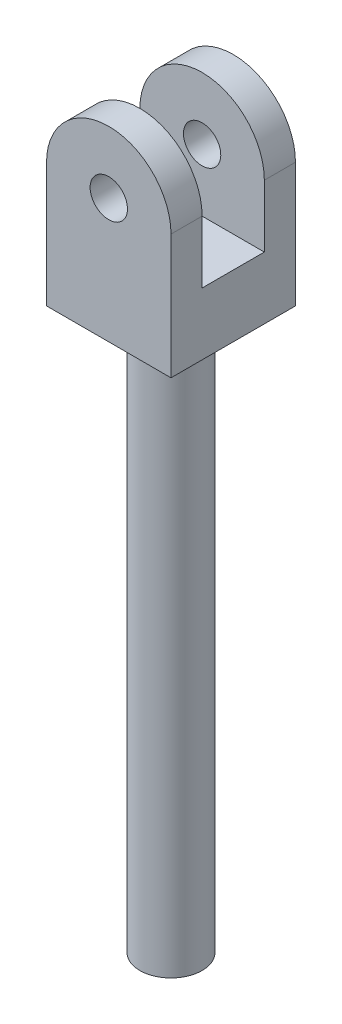
ISO-10303-21;
HEADER;
FILE_DESCRIPTION(('STEP AP214'),'2;1');
FILE_NAME('part.step','',(''),(''),'','','');
FILE_SCHEMA(('AUTOMOTIVE_DESIGN { 1 0 10303 214 1 1 1 1 }'));
ENDSEC;
DATA;
#1=APPLICATION_CONTEXT('core data for automotive mechanical design processes');
#2=APPLICATION_PROTOCOL_DEFINITION('international standard','automotive_design',2000,#1);
#3=PRODUCT_CONTEXT('',#1,'mechanical');
#4=PRODUCT('Part','Part','',(#3));
#5=PRODUCT_RELATED_PRODUCT_CATEGORY('part','',(#4));
#6=PRODUCT_DEFINITION_FORMATION('','',#4);
#7=PRODUCT_DEFINITION_CONTEXT('part definition',#1,'design');
#8=PRODUCT_DEFINITION('design','',#6,#7);
#9=PRODUCT_DEFINITION_SHAPE('','',#8);
#10=(LENGTH_UNIT() NAMED_UNIT(*) SI_UNIT(.MILLI.,.METRE.));
#11=(NAMED_UNIT(*) PLANE_ANGLE_UNIT() SI_UNIT($,.RADIAN.));
#12=(NAMED_UNIT(*) SI_UNIT($,.STERADIAN.) SOLID_ANGLE_UNIT());
#13=UNCERTAINTY_MEASURE_WITH_UNIT(LENGTH_MEASURE(1.E-05),#10,'distance_accuracy_value','');
#14=(GEOMETRIC_REPRESENTATION_CONTEXT(3) GLOBAL_UNCERTAINTY_ASSIGNED_CONTEXT((#13)) GLOBAL_UNIT_ASSIGNED_CONTEXT((#10,
#11,#12)) REPRESENTATION_CONTEXT('',''));
#15=CARTESIAN_POINT('',(0.,0.,0.));
#16=DIRECTION('',(0.,0.,1.));
#17=DIRECTION('',(1.,0.,0.));
#18=AXIS2_PLACEMENT_3D('',#15,#16,#17);
#19=CARTESIAN_POINT('',(0.,0.,10.));
#20=DIRECTION('',(0.,0.,-1.));
#21=DIRECTION('',(-1.,0.,0.));
#22=AXIS2_PLACEMENT_3D('',#19,#20,#21);
#23=CYLINDRICAL_SURFACE('',#22,5.);
#24=CARTESIAN_POINT('',(0.,0.,2.5));
#25=DIRECTION('',(0.,0.,-1.));
#26=DIRECTION('',(0.,1.,0.));
#27=AXIS2_PLACEMENT_3D('',#24,#25,#26);
#28=CIRCLE('',#27,5.);
#29=CARTESIAN_POINT('',(-5.,0.,2.5));
#30=VERTEX_POINT('',#29);
#31=CARTESIAN_POINT('',(5.,0.,2.5));
#32=VERTEX_POINT('',#31);
#33=EDGE_CURVE('E119',#30,#32,#28,.T.);
#34=ORIENTED_EDGE('',*,*,#33,.T.);
#35=DIRECTION('',(0.,0.,-1.));
#36=VECTOR('',#35,1.);
#37=CARTESIAN_POINT('',(5.,0.,10.));
#38=LINE('',#37,#36);
#39=CARTESIAN_POINT('',(5.,0.,0.));
#40=VERTEX_POINT('',#39);
#41=EDGE_CURVE('E78',#32,#40,#38,.T.);
#42=ORIENTED_EDGE('',*,*,#41,.T.);
#43=CARTESIAN_POINT('',(0.,0.,0.));
#44=DIRECTION('',(0.,0.,1.));
#45=DIRECTION('',(1.,0.,0.));
#46=AXIS2_PLACEMENT_3D('',#43,#44,#45);
#47=CIRCLE('',#46,5.);
#48=CARTESIAN_POINT('',(-5.,0.,0.));
#49=VERTEX_POINT('',#48);
#50=EDGE_CURVE('E145',#40,#49,#47,.T.);
#51=ORIENTED_EDGE('',*,*,#50,.T.);
#52=DIRECTION('',(0.,0.,-1.));
#53=VECTOR('',#52,1.);
#54=CARTESIAN_POINT('',(-5.,0.,10.));
#55=LINE('',#54,#53);
#56=EDGE_CURVE('E170',#30,#49,#55,.T.);
#57=ORIENTED_EDGE('',*,*,#56,.F.);
#58=EDGE_LOOP('',(#34,#42,#51,#57));
#59=FACE_BOUND('',#58,.T.);
#60=ADVANCED_FACE('F32',(#59),#23,.T.);
#61=CARTESIAN_POINT('',(0.,0.,10.));
#62=DIRECTION('',(0.,0.,-1.));
#63=DIRECTION('',(-1.,0.,0.));
#64=AXIS2_PLACEMENT_3D('',#61,#62,#63);
#65=CYLINDRICAL_SURFACE('',#64,1.5);
#66=CARTESIAN_POINT('',(0.,0.,2.5));
#67=DIRECTION('',(0.,0.,-1.));
#68=DIRECTION('',(0.,1.,0.));
#69=AXIS2_PLACEMENT_3D('',#66,#67,#68);
#70=CIRCLE('',#69,1.5);
#71=CARTESIAN_POINT('',(0.,1.5,2.5));
#72=VERTEX_POINT('',#71);
#73=EDGE_CURVE('E134',#72,#72,#70,.T.);
#74=ORIENTED_EDGE('',*,*,#73,.F.);
#75=EDGE_LOOP('',(#74));
#76=FACE_BOUND('',#75,.T.);
#77=CARTESIAN_POINT('',(0.,0.,0.));
#78=DIRECTION('',(0.,0.,1.));
#79=DIRECTION('',(1.,0.,0.));
#80=AXIS2_PLACEMENT_3D('',#77,#78,#79);
#81=CIRCLE('',#80,1.5);
#82=CARTESIAN_POINT('',(1.5,0.,0.));
#83=VERTEX_POINT('',#82);
#84=EDGE_CURVE('E141',#83,#83,#81,.T.);
#85=ORIENTED_EDGE('',*,*,#84,.F.);
#86=EDGE_LOOP('',(#85));
#87=FACE_BOUND('',#86,.T.);
#88=ADVANCED_FACE('F180',(#76,#87),#65,.F.);
#89=CARTESIAN_POINT('',(-5.,-10.,10.));
#90=DIRECTION('',(0.,1.,0.));
#91=DIRECTION('',(0.,0.,1.));
#92=AXIS2_PLACEMENT_3D('',#89,#90,#91);
#93=PLANE('',#92);
#94=DIRECTION('',(1.,0.,0.));
#95=VECTOR('',#94,1.);
#96=CARTESIAN_POINT('',(-5.,-10.,0.));
#97=LINE('',#96,#95);
#98=CARTESIAN_POINT('',(-5.,-10.,0.));
#99=VERTEX_POINT('',#98);
#100=CARTESIAN_POINT('',(5.,-10.,0.));
#101=VERTEX_POINT('',#100);
#102=EDGE_CURVE('E158',#99,#101,#97,.T.);
#103=ORIENTED_EDGE('',*,*,#102,.T.);
#104=DIRECTION('',(0.,0.,-1.));
#105=VECTOR('',#104,1.);
#106=CARTESIAN_POINT('',(5.,-10.,10.));
#107=LINE('',#106,#105);
#108=CARTESIAN_POINT('',(5.,-10.,10.));
#109=VERTEX_POINT('',#108);
#110=EDGE_CURVE('E164',#109,#101,#107,.T.);
#111=ORIENTED_EDGE('',*,*,#110,.F.);
#112=DIRECTION('',(1.,0.,0.));
#113=VECTOR('',#112,1.);
#114=CARTESIAN_POINT('',(-5.,-10.,10.));
#115=LINE('',#114,#113);
#116=CARTESIAN_POINT('',(-5.,-10.,10.));
#117=VERTEX_POINT('',#116);
#118=EDGE_CURVE('E152',#117,#109,#115,.T.);
#119=ORIENTED_EDGE('',*,*,#118,.F.);
#120=DIRECTION('',(0.,0.,-1.));
#121=VECTOR('',#120,1.);
#122=CARTESIAN_POINT('',(-5.,-10.,10.));
#123=LINE('',#122,#121);
#124=EDGE_CURVE('E167',#117,#99,#123,.T.);
#125=ORIENTED_EDGE('',*,*,#124,.T.);
#126=EDGE_LOOP('',(#103,#111,#119,#125));
#127=FACE_BOUND('',#126,.T.);
#128=CARTESIAN_POINT('',(0.,-9.99999999999999,5.));
#129=DIRECTION('',(0.,1.,0.));
#130=DIRECTION('',(0.,0.,1.));
#131=AXIS2_PLACEMENT_3D('',#128,#129,#130);
#132=CIRCLE('',#131,2.5);
#133=CARTESIAN_POINT('',(0.,-10.,7.5));
#134=VERTEX_POINT('',#133);
#135=EDGE_CURVE('E40',#134,#134,#132,.F.);
#136=ORIENTED_EDGE('',*,*,#135,.F.);
#137=EDGE_LOOP('',(#136));
#138=FACE_BOUND('',#137,.T.);
#139=ADVANCED_FACE('F183',(#127,#138),#93,.F.);
#140=CARTESIAN_POINT('',(0.,0.,10.));
#141=DIRECTION('',(0.,0.,1.));
#142=DIRECTION('',(1.,0.,0.));
#143=AXIS2_PLACEMENT_3D('',#140,#141,#142);
#144=PLANE('',#143);
#145=CARTESIAN_POINT('',(0.,0.,10.));
#146=DIRECTION('',(0.,0.,1.));
#147=DIRECTION('',(1.,0.,0.));
#148=AXIS2_PLACEMENT_3D('',#145,#146,#147);
#149=CIRCLE('',#148,5.);
#150=CARTESIAN_POINT('',(5.,0.,10.));
#151=VERTEX_POINT('',#150);
#152=CARTESIAN_POINT('',(-5.,0.,10.));
#153=VERTEX_POINT('',#152);
#154=EDGE_CURVE('E148',#151,#153,#149,.T.);
#155=ORIENTED_EDGE('',*,*,#154,.T.);
#156=DIRECTION('',(0.,-1.,0.));
#157=VECTOR('',#156,1.);
#158=CARTESIAN_POINT('',(-5.,0.,10.));
#159=LINE('',#158,#157);
#160=EDGE_CURVE('E86',#153,#117,#159,.T.);
#161=ORIENTED_EDGE('',*,*,#160,.T.);
#162=ORIENTED_EDGE('',*,*,#118,.T.);
#163=DIRECTION('',(0.,1.,0.));
#164=VECTOR('',#163,1.);
#165=CARTESIAN_POINT('',(5.,-10.,10.));
#166=LINE('',#165,#164);
#167=EDGE_CURVE('E56',#109,#151,#166,.T.);
#168=ORIENTED_EDGE('',*,*,#167,.T.);
#169=EDGE_LOOP('',(#155,#161,#162,#168));
#170=FACE_BOUND('',#169,.T.);
#171=CARTESIAN_POINT('',(0.,0.,10.));
#172=DIRECTION('',(0.,0.,1.));
#173=DIRECTION('',(1.,0.,0.));
#174=AXIS2_PLACEMENT_3D('',#171,#172,#173);
#175=CIRCLE('',#174,1.5);
#176=CARTESIAN_POINT('',(1.5,0.,10.));
#177=VERTEX_POINT('',#176);
#178=EDGE_CURVE('E142',#177,#177,#175,.T.);
#179=ORIENTED_EDGE('',*,*,#178,.F.);
#180=EDGE_LOOP('',(#179));
#181=FACE_BOUND('',#180,.T.);
#182=ADVANCED_FACE('F190',(#170,#181),#144,.T.);
#183=CARTESIAN_POINT('',(0.,0.,0.));
#184=DIRECTION('',(0.,0.,1.));
#185=DIRECTION('',(1.,0.,0.));
#186=AXIS2_PLACEMENT_3D('',#183,#184,#185);
#187=PLANE('',#186);
#188=ORIENTED_EDGE('',*,*,#50,.F.);
#189=DIRECTION('',(0.,1.,0.));
#190=VECTOR('',#189,1.);
#191=CARTESIAN_POINT('',(5.,-10.,0.));
#192=LINE('',#191,#190);
#193=EDGE_CURVE('E150',#101,#40,#192,.T.);
#194=ORIENTED_EDGE('',*,*,#193,.F.);
#195=ORIENTED_EDGE('',*,*,#102,.F.);
#196=DIRECTION('',(0.,-1.,0.));
#197=VECTOR('',#196,1.);
#198=CARTESIAN_POINT('',(-5.,0.,0.));
#199=LINE('',#198,#197);
#200=EDGE_CURVE('E156',#49,#99,#199,.T.);
#201=ORIENTED_EDGE('',*,*,#200,.F.);
#202=EDGE_LOOP('',(#188,#194,#195,#201));
#203=FACE_BOUND('',#202,.T.);
#204=ORIENTED_EDGE('',*,*,#84,.T.);
#205=EDGE_LOOP('',(#204));
#206=FACE_BOUND('',#205,.T.);
#207=ADVANCED_FACE('F188',(#203,#206),#187,.F.);
#208=CARTESIAN_POINT('',(5.,0.,7.5));
#209=VERTEX_POINT('',#208);
#210=EDGE_CURVE('E161',#151,#209,#38,.T.);
#211=ORIENTED_EDGE('',*,*,#210,.T.);
#212=CARTESIAN_POINT('',(0.,0.,7.5));
#213=DIRECTION('',(0.,0.,1.));
#214=DIRECTION('',(0.,-1.,0.));
#215=AXIS2_PLACEMENT_3D('',#212,#213,#214);
#216=CIRCLE('',#215,5.);
#217=CARTESIAN_POINT('',(-5.,0.,7.5));
#218=VERTEX_POINT('',#217);
#219=EDGE_CURVE('E132',#209,#218,#216,.T.);
#220=ORIENTED_EDGE('',*,*,#219,.T.);
#221=EDGE_CURVE('E171',#153,#218,#55,.T.);
#222=ORIENTED_EDGE('',*,*,#221,.F.);
#223=ORIENTED_EDGE('',*,*,#154,.F.);
#224=EDGE_LOOP('',(#211,#220,#222,#223));
#225=FACE_BOUND('',#224,.T.);
#226=ADVANCED_FACE('F34',(#225),#23,.T.);
#227=CARTESIAN_POINT('',(-5.,0.,10.));
#228=DIRECTION('',(1.,0.,0.));
#229=DIRECTION('',(0.,1.,0.));
#230=AXIS2_PLACEMENT_3D('',#227,#228,#229);
#231=PLANE('',#230);
#232=DIRECTION('',(0.,0.,1.));
#233=VECTOR('',#232,1.);
#234=CARTESIAN_POINT('',(-5.,-5.,2.5));
#235=LINE('',#234,#233);
#236=CARTESIAN_POINT('',(-5.,-5.,2.5));
#237=VERTEX_POINT('',#236);
#238=CARTESIAN_POINT('',(-5.,-5.,7.5));
#239=VERTEX_POINT('',#238);
#240=EDGE_CURVE('E109',#237,#239,#235,.T.);
#241=ORIENTED_EDGE('',*,*,#240,.F.);
#242=DIRECTION('',(0.,-1.,0.));
#243=VECTOR('',#242,1.);
#244=CARTESIAN_POINT('',(-5.,5.,2.5));
#245=LINE('',#244,#243);
#246=EDGE_CURVE('E117',#30,#237,#245,.T.);
#247=ORIENTED_EDGE('',*,*,#246,.F.);
#248=ORIENTED_EDGE('',*,*,#56,.T.);
#249=ORIENTED_EDGE('',*,*,#200,.T.);
#250=ORIENTED_EDGE('',*,*,#124,.F.);
#251=ORIENTED_EDGE('',*,*,#160,.F.);
#252=ORIENTED_EDGE('',*,*,#221,.T.);
#253=DIRECTION('',(0.,1.,0.));
#254=VECTOR('',#253,1.);
#255=CARTESIAN_POINT('',(-5.,5.,7.5));
#256=LINE('',#255,#254);
#257=EDGE_CURVE('E114',#239,#218,#256,.T.);
#258=ORIENTED_EDGE('',*,*,#257,.F.);
#259=EDGE_LOOP('',(#241,#247,#248,#249,#250,#251,#252,#258));
#260=FACE_BOUND('',#259,.T.);
#261=ADVANCED_FACE('F122',(#260),#231,.F.);
#262=CARTESIAN_POINT('',(5.,-10.,10.));
#263=DIRECTION('',(-1.,0.,0.));
#264=DIRECTION('',(0.,-1.,0.));
#265=AXIS2_PLACEMENT_3D('',#262,#263,#264);
#266=PLANE('',#265);
#267=ORIENTED_EDGE('',*,*,#41,.F.);
#268=DIRECTION('',(0.,-1.,0.));
#269=VECTOR('',#268,1.);
#270=CARTESIAN_POINT('',(5.,-10.,2.5));
#271=LINE('',#270,#269);
#272=CARTESIAN_POINT('',(5.,-5.,2.5));
#273=VERTEX_POINT('',#272);
#274=EDGE_CURVE('E135',#32,#273,#271,.T.);
#275=ORIENTED_EDGE('',*,*,#274,.T.);
#276=DIRECTION('',(0.,0.,1.));
#277=VECTOR('',#276,1.);
#278=CARTESIAN_POINT('',(5.,-5.,10.));
#279=LINE('',#278,#277);
#280=CARTESIAN_POINT('',(5.,-5.,7.5));
#281=VERTEX_POINT('',#280);
#282=EDGE_CURVE('E11',#273,#281,#279,.T.);
#283=ORIENTED_EDGE('',*,*,#282,.T.);
#284=DIRECTION('',(0.,1.,0.));
#285=VECTOR('',#284,1.);
#286=CARTESIAN_POINT('',(5.,-10.,7.5));
#287=LINE('',#286,#285);
#288=EDGE_CURVE('E129',#281,#209,#287,.T.);
#289=ORIENTED_EDGE('',*,*,#288,.T.);
#290=ORIENTED_EDGE('',*,*,#210,.F.);
#291=ORIENTED_EDGE('',*,*,#167,.F.);
#292=ORIENTED_EDGE('',*,*,#110,.T.);
#293=ORIENTED_EDGE('',*,*,#193,.T.);
#294=EDGE_LOOP('',(#267,#275,#283,#289,#290,#291,#292,#293));
#295=FACE_BOUND('',#294,.T.);
#296=ADVANCED_FACE('F205',(#295),#266,.F.);
#297=CARTESIAN_POINT('',(0.,0.,7.5));
#298=DIRECTION('',(0.,0.,1.));
#299=DIRECTION('',(0.,-1.,0.));
#300=AXIS2_PLACEMENT_3D('',#297,#298,#299);
#301=CIRCLE('',#300,1.5);
#302=CARTESIAN_POINT('',(0.,-1.5,7.5));
#303=VERTEX_POINT('',#302);
#304=EDGE_CURVE('E127',#303,#303,#301,.T.);
#305=ORIENTED_EDGE('',*,*,#304,.F.);
#306=EDGE_LOOP('',(#305));
#307=FACE_BOUND('',#306,.T.);
#308=ORIENTED_EDGE('',*,*,#178,.T.);
#309=EDGE_LOOP('',(#308));
#310=FACE_BOUND('',#309,.T.);
#311=ADVANCED_FACE('F185',(#307,#310),#65,.F.);
#312=CARTESIAN_POINT('',(0.,-55.,5.));
#313=DIRECTION('',(0.,1.,0.));
#314=DIRECTION('',(0.,0.,1.));
#315=AXIS2_PLACEMENT_3D('',#312,#313,#314);
#316=CYLINDRICAL_SURFACE('',#315,2.5);
#317=CARTESIAN_POINT('',(0.,-55.,5.));
#318=DIRECTION('',(0.,-1.,0.));
#319=DIRECTION('',(0.,0.,-1.));
#320=AXIS2_PLACEMENT_3D('',#317,#318,#319);
#321=CIRCLE('',#320,2.5);
#322=CARTESIAN_POINT('',(0.,-55.,7.5));
#323=VERTEX_POINT('',#322);
#324=EDGE_CURVE('E138',#323,#323,#321,.T.);
#325=CARTESIAN_POINT('',(0.,-55.,7.5));
#326=CARTESIAN_POINT('',(0.,-54.53125,7.5));
#327=CARTESIAN_POINT('',(0.,-54.0625,7.5));
#328=CARTESIAN_POINT('',(0.,-53.125,7.5));
#329=CARTESIAN_POINT('',(0.,-52.65625,7.5));
#330=CARTESIAN_POINT('',(0.,-51.71875,7.5));
#331=CARTESIAN_POINT('',(0.,-51.25,7.5));
#332=CARTESIAN_POINT('',(0.,-50.3125,7.5));
#333=CARTESIAN_POINT('',(0.,-49.84375,7.5));
#334=CARTESIAN_POINT('',(0.,-48.90625,7.5));
#335=CARTESIAN_POINT('',(0.,-48.4375,7.5));
#336=CARTESIAN_POINT('',(0.,-47.5,7.5));
#337=CARTESIAN_POINT('',(0.,-47.03125,7.5));
#338=CARTESIAN_POINT('',(0.,-46.09375,7.5));
#339=CARTESIAN_POINT('',(0.,-45.625,7.5));
#340=CARTESIAN_POINT('',(0.,-44.6875,7.5));
#341=CARTESIAN_POINT('',(0.,-44.21875,7.5));
#342=CARTESIAN_POINT('',(0.,-43.28125,7.5));
#343=CARTESIAN_POINT('',(0.,-42.8125,7.5));
#344=CARTESIAN_POINT('',(0.,-41.875,7.5));
#345=CARTESIAN_POINT('',(0.,-41.40625,7.5));
#346=CARTESIAN_POINT('',(0.,-40.46875,7.5));
#347=CARTESIAN_POINT('',(0.,-40.,7.5));
#348=CARTESIAN_POINT('',(0.,-39.0625,7.5));
#349=CARTESIAN_POINT('',(0.,-38.59375,7.5));
#350=CARTESIAN_POINT('',(0.,-37.65625,7.5));
#351=CARTESIAN_POINT('',(0.,-37.1875,7.5));
#352=CARTESIAN_POINT('',(0.,-36.25,7.5));
#353=CARTESIAN_POINT('',(0.,-35.78125,7.5));
#354=CARTESIAN_POINT('',(0.,-34.84375,7.5));
#355=CARTESIAN_POINT('',(0.,-34.375,7.5));
#356=CARTESIAN_POINT('',(0.,-33.4375,7.5));
#357=CARTESIAN_POINT('',(0.,-32.96875,7.5));
#358=CARTESIAN_POINT('',(0.,-32.03125,7.5));
#359=CARTESIAN_POINT('',(0.,-31.5625,7.5));
#360=CARTESIAN_POINT('',(0.,-30.625,7.5));
#361=CARTESIAN_POINT('',(0.,-30.15625,7.5));
#362=CARTESIAN_POINT('',(0.,-29.21875,7.5));
#363=CARTESIAN_POINT('',(0.,-28.75,7.5));
#364=CARTESIAN_POINT('',(0.,-27.8125,7.5));
#365=CARTESIAN_POINT('',(0.,-27.34375,7.5));
#366=CARTESIAN_POINT('',(0.,-26.40625,7.5));
#367=CARTESIAN_POINT('',(0.,-25.9375,7.5));
#368=CARTESIAN_POINT('',(0.,-25.,7.5));
#369=CARTESIAN_POINT('',(0.,-24.53125,7.5));
#370=CARTESIAN_POINT('',(0.,-23.59375,7.5));
#371=CARTESIAN_POINT('',(0.,-23.125,7.5));
#372=CARTESIAN_POINT('',(0.,-22.1875,7.5));
#373=CARTESIAN_POINT('',(0.,-21.71875,7.5));
#374=CARTESIAN_POINT('',(0.,-20.78125,7.5));
#375=CARTESIAN_POINT('',(0.,-20.3125,7.5));
#376=CARTESIAN_POINT('',(0.,-19.375,7.5));
#377=CARTESIAN_POINT('',(0.,-18.90625,7.5));
#378=CARTESIAN_POINT('',(0.,-17.96875,7.5));
#379=CARTESIAN_POINT('',(0.,-17.5,7.5));
#380=CARTESIAN_POINT('',(0.,-16.5625,7.5));
#381=CARTESIAN_POINT('',(0.,-16.09375,7.5));
#382=CARTESIAN_POINT('',(0.,-15.15625,7.5));
#383=CARTESIAN_POINT('',(0.,-14.6875,7.5));
#384=CARTESIAN_POINT('',(0.,-13.75,7.5));
#385=CARTESIAN_POINT('',(0.,-13.28125,7.5));
#386=CARTESIAN_POINT('',(0.,-12.34375,7.5));
#387=CARTESIAN_POINT('',(0.,-11.875,7.5));
#388=CARTESIAN_POINT('',(0.,-10.9375,7.5));
#389=CARTESIAN_POINT('',(0.,-10.46875,7.5));
#390=CARTESIAN_POINT('',(0.,-10.,7.5));
#391=B_SPLINE_CURVE_WITH_KNOTS('',3,(#325,#326,#327,#328,#329,#330,#331,#332,#333,#334,#335,
#336,#337,#338,#339,#340,#341,#342,#343,#344,#345,#346,#347,#348,#349,#350,#351,#352,#353,#354,
#355,#356,#357,#358,#359,#360,#361,#362,#363,#364,#365,#366,#367,#368,#369,#370,#371,#372,#373,
#374,#375,#376,#377,#378,#379,#380,#381,#382,#383,#384,#385,#386,#387,#388,#389,#390),
.UNSPECIFIED.,.F.,.F.,(4,2,2,2,2,2,2,2,2,2,2,2,2,2,2,2,2,2,2,2,2,2,2,2,2,2,2,2,2,2,2,2,4),(0.,
1.40625,2.8125,4.21874999999999,5.625,7.03125,8.43749999999999,9.84374999999999,11.25,12.65625,
14.0625,15.46875,16.875,18.28125,19.6875,21.09375,22.5,23.90625,25.3125,26.71875,28.125,
29.53125,30.9375,32.34375,33.75,35.15625,36.5625,37.96875,39.375,40.78125,42.1875,43.59375,45.),.UNSPECIFIED.);
#392=EDGE_CURVE('BSEAM231',#323,#134,#391,.T.);
#393=ORIENTED_EDGE('',*,*,#324,.F.);
#394=ORIENTED_EDGE('',*,*,#135,.T.);
#395=ORIENTED_EDGE('',*,*,#392,.T.);
#396=ORIENTED_EDGE('',*,*,#392,.F.);
#397=EDGE_LOOP('',(#393,#395,#394,#396));
#398=FACE_BOUND('',#397,.T.);
#399=ADVANCED_FACE('F231',(#398),#316,.T.);
#400=CARTESIAN_POINT('',(0.,-55.,5.));
#401=DIRECTION('',(0.,-1.,0.));
#402=DIRECTION('',(0.,0.,-1.));
#403=AXIS2_PLACEMENT_3D('',#400,#401,#402);
#404=PLANE('',#403);
#405=ORIENTED_EDGE('',*,*,#324,.T.);
#406=EDGE_LOOP('',(#405));
#407=FACE_BOUND('',#406,.T.);
#408=ADVANCED_FACE('F227',(#407),#404,.T.);
#409=CARTESIAN_POINT('',(35.,-4.99999999999999,2.5));
#410=DIRECTION('',(0.,-1.,0.));
#411=DIRECTION('',(1.,0.,0.));
#412=AXIS2_PLACEMENT_3D('',#409,#410,#411);
#413=PLANE('',#412);
#414=DIRECTION('',(-1.,0.,0.));
#415=VECTOR('',#414,1.);
#416=CARTESIAN_POINT('',(35.,-4.99999999999999,2.5));
#417=LINE('',#416,#415);
#418=EDGE_CURVE('E105',#273,#237,#417,.T.);
#419=ORIENTED_EDGE('',*,*,#418,.T.);
#420=ORIENTED_EDGE('',*,*,#240,.T.);
#421=DIRECTION('',(-1.,0.,0.));
#422=VECTOR('',#421,1.);
#423=CARTESIAN_POINT('',(35.,-4.99999999999999,7.5));
#424=LINE('',#423,#422);
#425=EDGE_CURVE('E47',#281,#239,#424,.T.);
#426=ORIENTED_EDGE('',*,*,#425,.F.);
#427=ORIENTED_EDGE('',*,*,#282,.F.);
#428=EDGE_LOOP('',(#419,#420,#426,#427));
#429=FACE_BOUND('',#428,.T.);
#430=ADVANCED_FACE('F107',(#429),#413,.F.);
#431=CARTESIAN_POINT('',(35.,5.00000000000001,2.5));
#432=DIRECTION('',(0.,0.,-1.));
#433=DIRECTION('',(0.,1.,0.));
#434=AXIS2_PLACEMENT_3D('',#431,#432,#433);
#435=PLANE('',#434);
#436=ORIENTED_EDGE('',*,*,#73,.T.);
#437=EDGE_LOOP('',(#436));
#438=FACE_BOUND('',#437,.T.);
#439=ORIENTED_EDGE('',*,*,#246,.T.);
#440=ORIENTED_EDGE('',*,*,#418,.F.);
#441=ORIENTED_EDGE('',*,*,#274,.F.);
#442=ORIENTED_EDGE('',*,*,#33,.F.);
#443=EDGE_LOOP('',(#439,#440,#441,#442));
#444=FACE_BOUND('',#443,.T.);
#445=ADVANCED_FACE('F118',(#438,#444),#435,.F.);
#446=CARTESIAN_POINT('',(35.,5.00000000000001,7.5));
#447=DIRECTION('',(0.,0.,1.));
#448=DIRECTION('',(0.,-1.,0.));
#449=AXIS2_PLACEMENT_3D('',#446,#447,#448);
#450=PLANE('',#449);
#451=ORIENTED_EDGE('',*,*,#304,.T.);
#452=EDGE_LOOP('',(#451));
#453=FACE_BOUND('',#452,.T.);
#454=ORIENTED_EDGE('',*,*,#219,.F.);
#455=ORIENTED_EDGE('',*,*,#288,.F.);
#456=ORIENTED_EDGE('',*,*,#425,.T.);
#457=ORIENTED_EDGE('',*,*,#257,.T.);
#458=EDGE_LOOP('',(#454,#455,#456,#457));
#459=FACE_BOUND('',#458,.T.);
#460=ADVANCED_FACE('F217',(#453,#459),#450,.F.);
#461=CLOSED_SHELL('',(#60,#88,#139,#182,#207,#226,#261,#296,#311,#399,#408,#430,#445,#460));
#462=MANIFOLD_SOLID_BREP('B2',#461);
#463=ADVANCED_BREP_SHAPE_REPRESENTATION('',(#18,#462),#14);
#464=SHAPE_DEFINITION_REPRESENTATION(#9,#463);
ENDSEC;
END-ISO-10303-21;
